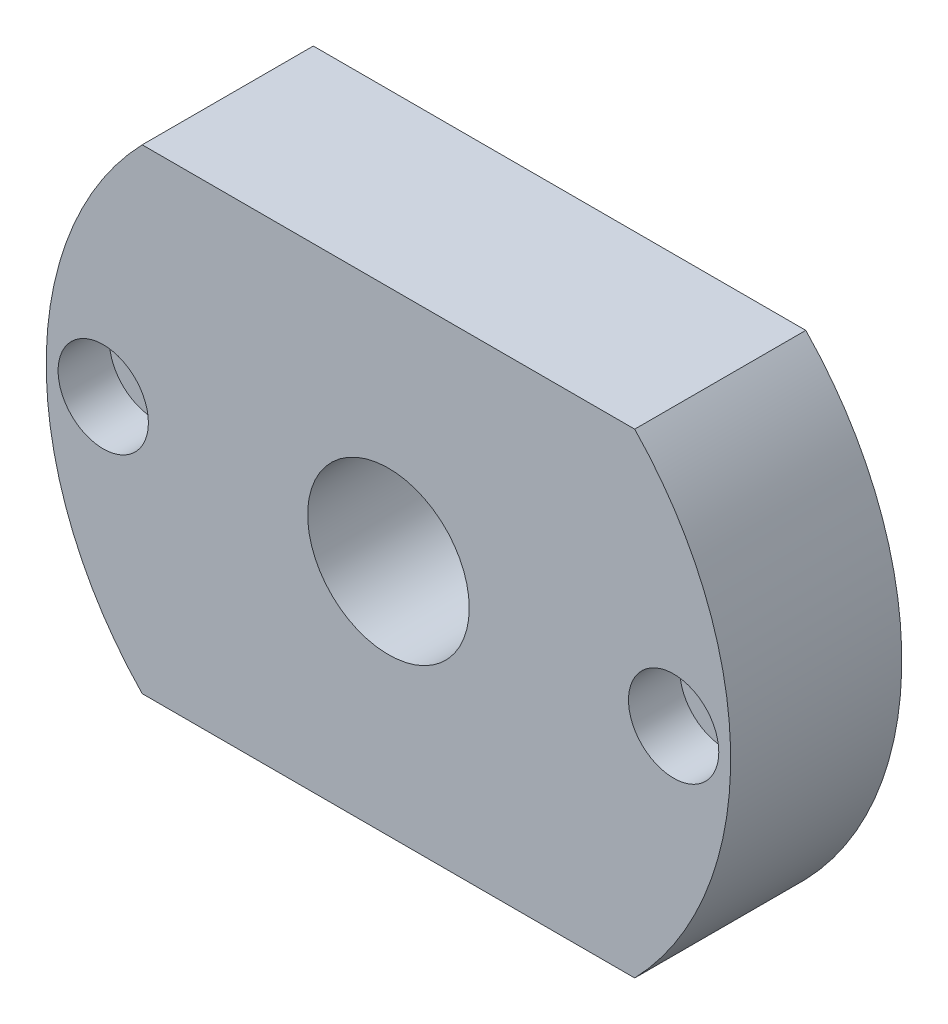
ISO-10303-21;
HEADER;
FILE_DESCRIPTION(('STEP AP214'),'2;1');
FILE_NAME('part.step','',(''),(''),'','','');
FILE_SCHEMA(('AUTOMOTIVE_DESIGN { 1 0 10303 214 1 1 1 1 }'));
ENDSEC;
DATA;
#1=APPLICATION_CONTEXT('core data for automotive mechanical design processes');
#2=APPLICATION_PROTOCOL_DEFINITION('international standard','automotive_design',2000,#1);
#3=PRODUCT_CONTEXT('',#1,'mechanical');
#4=PRODUCT('Part','Part','',(#3));
#5=PRODUCT_RELATED_PRODUCT_CATEGORY('part','',(#4));
#6=PRODUCT_DEFINITION_FORMATION('','',#4);
#7=PRODUCT_DEFINITION_CONTEXT('part definition',#1,'design');
#8=PRODUCT_DEFINITION('design','',#6,#7);
#9=PRODUCT_DEFINITION_SHAPE('','',#8);
#10=(LENGTH_UNIT() NAMED_UNIT(*) SI_UNIT(.MILLI.,.METRE.));
#11=(NAMED_UNIT(*) PLANE_ANGLE_UNIT() SI_UNIT($,.RADIAN.));
#12=(NAMED_UNIT(*) SI_UNIT($,.STERADIAN.) SOLID_ANGLE_UNIT());
#13=UNCERTAINTY_MEASURE_WITH_UNIT(LENGTH_MEASURE(1.E-05),#10,'distance_accuracy_value','');
#14=(GEOMETRIC_REPRESENTATION_CONTEXT(3) GLOBAL_UNCERTAINTY_ASSIGNED_CONTEXT((#13)) GLOBAL_UNIT_ASSIGNED_CONTEXT((#10,
#11,#12)) REPRESENTATION_CONTEXT('',''));
#15=CARTESIAN_POINT('',(0.,0.,0.));
#16=DIRECTION('',(0.,0.,1.));
#17=DIRECTION('',(1.,0.,0.));
#18=AXIS2_PLACEMENT_3D('',#15,#16,#17);
#19=CARTESIAN_POINT('',(506.510652388512,-401.151572168843,-658.825));
#20=DIRECTION('',(0.,0.,1.));
#21=DIRECTION('',(1.,0.,0.));
#22=AXIS2_PLACEMENT_3D('',#19,#20,#21);
#23=CYLINDRICAL_SURFACE('',#22,4.75);
#24=CARTESIAN_POINT('',(506.510652388512,-401.151572168843,-658.825));
#25=DIRECTION('',(0.,0.,1.));
#26=DIRECTION('',(1.,0.,0.));
#27=AXIS2_PLACEMENT_3D('',#24,#25,#26);
#28=CIRCLE('',#27,4.75);
#29=CARTESIAN_POINT('',(511.260652388512,-401.151572168843,-658.825));
#30=VERTEX_POINT('',#29);
#31=EDGE_CURVE('E20',#30,#30,#28,.F.);
#32=ORIENTED_EDGE('',*,*,#31,.F.);
#33=EDGE_LOOP('',(#32));
#34=FACE_BOUND('',#33,.T.);
#35=CARTESIAN_POINT('',(506.510652388512,-401.151572168843,-664.225));
#36=DIRECTION('',(0.,0.,1.));
#37=DIRECTION('',(1.,0.,0.));
#38=AXIS2_PLACEMENT_3D('',#35,#36,#37);
#39=CIRCLE('',#38,4.75);
#40=CARTESIAN_POINT('',(511.260652388512,-401.151572168843,-664.225));
#41=VERTEX_POINT('',#40);
#42=EDGE_CURVE('E124',#41,#41,#39,.T.);
#43=ORIENTED_EDGE('',*,*,#42,.F.);
#44=EDGE_LOOP('',(#43));
#45=FACE_BOUND('',#44,.T.);
#46=ADVANCED_FACE('F17',(#34,#45),#23,.F.);
#47=CARTESIAN_POINT('',(446.510652388512,-401.151572168843,-658.825));
#48=DIRECTION('',(0.,0.,1.));
#49=DIRECTION('',(1.,0.,0.));
#50=AXIS2_PLACEMENT_3D('',#47,#48,#49);
#51=CYLINDRICAL_SURFACE('',#50,4.75);
#52=CARTESIAN_POINT('',(446.510652388512,-401.151572168843,-658.825));
#53=DIRECTION('',(0.,0.,1.));
#54=DIRECTION('',(1.,0.,0.));
#55=AXIS2_PLACEMENT_3D('',#52,#53,#54);
#56=CIRCLE('',#55,4.75);
#57=CARTESIAN_POINT('',(451.260652388512,-401.151572168843,-658.825));
#58=VERTEX_POINT('',#57);
#59=EDGE_CURVE('E127',#58,#58,#56,.F.);
#60=ORIENTED_EDGE('',*,*,#59,.F.);
#61=EDGE_LOOP('',(#60));
#62=FACE_BOUND('',#61,.T.);
#63=CARTESIAN_POINT('',(446.510652388512,-401.151572168843,-664.225));
#64=DIRECTION('',(0.,0.,1.));
#65=DIRECTION('',(1.,0.,0.));
#66=AXIS2_PLACEMENT_3D('',#63,#64,#65);
#67=CIRCLE('',#66,4.75);
#68=CARTESIAN_POINT('',(451.260652388512,-401.151572168843,-664.225));
#69=VERTEX_POINT('',#68);
#70=EDGE_CURVE('E79',#69,#69,#67,.T.);
#71=ORIENTED_EDGE('',*,*,#70,.F.);
#72=EDGE_LOOP('',(#71));
#73=FACE_BOUND('',#72,.T.);
#74=ADVANCED_FACE('F140',(#62,#73),#51,.F.);
#75=CARTESIAN_POINT('',(401.510652388512,-401.151572168843,-658.825));
#76=DIRECTION('',(0.,0.,1.));
#77=DIRECTION('',(1.,0.,0.));
#78=AXIS2_PLACEMENT_3D('',#75,#76,#77);
#79=PLANE('',#78);
#80=ORIENTED_EDGE('',*,*,#59,.T.);
#81=EDGE_LOOP('',(#80));
#82=FACE_BOUND('',#81,.T.);
#83=ORIENTED_EDGE('',*,*,#31,.T.);
#84=EDGE_LOOP('',(#83));
#85=FACE_BOUND('',#84,.T.);
#86=CARTESIAN_POINT('',(476.510652388512,-401.151572168843,-658.825));
#87=DIRECTION('',(0.,0.,1.));
#88=DIRECTION('',(1.,0.,0.));
#89=AXIS2_PLACEMENT_3D('',#86,#87,#88);
#90=CIRCLE('',#89,8.5);
#91=CARTESIAN_POINT('',(485.010652388512,-401.151572168843,-658.825));
#92=VERTEX_POINT('',#91);
#93=EDGE_CURVE('E114',#92,#92,#90,.F.);
#94=ORIENTED_EDGE('',*,*,#93,.T.);
#95=EDGE_LOOP('',(#94));
#96=FACE_BOUND('',#95,.T.);
#97=DIRECTION('',(1.,0.,0.));
#98=VECTOR('',#97,1.);
#99=CARTESIAN_POINT('',(502.414320082489,-426.151572168843,-658.825));
#100=LINE('',#99,#98);
#101=CARTESIAN_POINT('',(502.414320082489,-426.151572168843,-658.825));
#102=VERTEX_POINT('',#101);
#103=CARTESIAN_POINT('',(450.606984694534,-426.151572168843,-658.825));
#104=VERTEX_POINT('',#103);
#105=EDGE_CURVE('E55',#102,#104,#100,.F.);
#106=ORIENTED_EDGE('',*,*,#105,.F.);
#107=CARTESIAN_POINT('',(476.510652388512,-401.151572168843,-658.825));
#108=DIRECTION('',(0.,0.,1.));
#109=DIRECTION('',(1.,0.,0.));
#110=AXIS2_PLACEMENT_3D('',#107,#108,#109);
#111=CIRCLE('',#110,36.);
#112=CARTESIAN_POINT('',(502.414320082489,-376.151572168843,-658.825));
#113=VERTEX_POINT('',#112);
#114=EDGE_CURVE('E74',#113,#102,#111,.F.);
#115=ORIENTED_EDGE('',*,*,#114,.F.);
#116=DIRECTION('',(-1.,0.,0.));
#117=VECTOR('',#116,1.);
#118=CARTESIAN_POINT('',(450.606984694534,-376.151572168843,-658.825));
#119=LINE('',#118,#117);
#120=CARTESIAN_POINT('',(450.606984694535,-376.151572168843,-658.825));
#121=VERTEX_POINT('',#120);
#122=EDGE_CURVE('E70',#121,#113,#119,.F.);
#123=ORIENTED_EDGE('',*,*,#122,.F.);
#124=CARTESIAN_POINT('',(476.510652388512,-401.151572168843,-658.825));
#125=DIRECTION('',(0.,0.,1.));
#126=DIRECTION('',(1.,0.,0.));
#127=AXIS2_PLACEMENT_3D('',#124,#125,#126);
#128=CIRCLE('',#127,36.);
#129=EDGE_CURVE('E60',#104,#121,#128,.F.);
#130=ORIENTED_EDGE('',*,*,#129,.F.);
#131=EDGE_LOOP('',(#106,#115,#123,#130));
#132=FACE_BOUND('',#131,.T.);
#133=ADVANCED_FACE('F73',(#82,#85,#96,#132),#79,.T.);
#134=CARTESIAN_POINT('',(401.510652388512,-401.151572168843,-664.225));
#135=DIRECTION('',(0.,0.,1.));
#136=DIRECTION('',(1.,0.,0.));
#137=AXIS2_PLACEMENT_3D('',#134,#135,#136);
#138=PLANE('',#137);
#139=CARTESIAN_POINT('',(506.510652388512,-401.151572168843,-664.225));
#140=DIRECTION('',(0.,0.,1.));
#141=DIRECTION('',(1.,0.,0.));
#142=AXIS2_PLACEMENT_3D('',#139,#140,#141);
#143=CIRCLE('',#142,2.6);
#144=CARTESIAN_POINT('',(509.110652388512,-401.151572168843,-664.225));
#145=VERTEX_POINT('',#144);
#146=EDGE_CURVE('E110',#145,#145,#143,.F.);
#147=ORIENTED_EDGE('',*,*,#146,.T.);
#148=EDGE_LOOP('',(#147));
#149=FACE_BOUND('',#148,.T.);
#150=ORIENTED_EDGE('',*,*,#42,.T.);
#151=EDGE_LOOP('',(#150));
#152=FACE_BOUND('',#151,.T.);
#153=ADVANCED_FACE('F143',(#149,#152),#138,.T.);
#154=CARTESIAN_POINT('',(401.510652388512,-401.151572168843,-664.225));
#155=DIRECTION('',(0.,0.,1.));
#156=DIRECTION('',(1.,0.,0.));
#157=AXIS2_PLACEMENT_3D('',#154,#155,#156);
#158=PLANE('',#157);
#159=CARTESIAN_POINT('',(446.510652388512,-401.151572168843,-664.225));
#160=DIRECTION('',(0.,0.,1.));
#161=DIRECTION('',(1.,0.,0.));
#162=AXIS2_PLACEMENT_3D('',#159,#160,#161);
#163=CIRCLE('',#162,2.6);
#164=CARTESIAN_POINT('',(449.110652388512,-401.151572168843,-664.225));
#165=VERTEX_POINT('',#164);
#166=EDGE_CURVE('E106',#165,#165,#163,.F.);
#167=ORIENTED_EDGE('',*,*,#166,.T.);
#168=EDGE_LOOP('',(#167));
#169=FACE_BOUND('',#168,.T.);
#170=ORIENTED_EDGE('',*,*,#70,.T.);
#171=EDGE_LOOP('',(#170));
#172=FACE_BOUND('',#171,.T.);
#173=ADVANCED_FACE('F145',(#169,#172),#158,.T.);
#174=CARTESIAN_POINT('',(450.606984694534,-376.151572168843,-676.825));
#175=DIRECTION('',(0.,1.,0.));
#176=DIRECTION('',(-1.,0.,0.));
#177=AXIS2_PLACEMENT_3D('',#174,#175,#176);
#178=PLANE('',#177);
#179=ORIENTED_EDGE('',*,*,#122,.T.);
#180=DIRECTION('',(0.,0.,1.));
#181=VECTOR('',#180,1.);
#182=CARTESIAN_POINT('',(502.414320082489,-376.151572168843,-676.825));
#183=LINE('',#182,#181);
#184=CARTESIAN_POINT('',(502.414320082489,-376.151572168843,-676.825));
#185=VERTEX_POINT('',#184);
#186=EDGE_CURVE('E119',#185,#113,#183,.T.);
#187=ORIENTED_EDGE('',*,*,#186,.F.);
#188=DIRECTION('',(1.,0.,0.));
#189=VECTOR('',#188,1.);
#190=CARTESIAN_POINT('',(401.510652388512,-376.151572168843,-676.825));
#191=LINE('',#190,#189);
#192=CARTESIAN_POINT('',(450.606984694535,-376.151572168843,-676.825));
#193=VERTEX_POINT('',#192);
#194=EDGE_CURVE('E83',#185,#193,#191,.F.);
#195=ORIENTED_EDGE('',*,*,#194,.T.);
#196=DIRECTION('',(0.,0.,1.));
#197=VECTOR('',#196,1.);
#198=CARTESIAN_POINT('',(450.606984694534,-376.151572168843,-676.825));
#199=LINE('',#198,#197);
#200=EDGE_CURVE('E65',#121,#193,#199,.F.);
#201=ORIENTED_EDGE('',*,*,#200,.F.);
#202=EDGE_LOOP('',(#179,#187,#195,#201));
#203=FACE_BOUND('',#202,.T.);
#204=ADVANCED_FACE('F82',(#203),#178,.T.);
#205=CARTESIAN_POINT('',(476.510652388512,-401.151572168843,-676.825));
#206=DIRECTION('',(0.,0.,1.));
#207=DIRECTION('',(1.,0.,0.));
#208=AXIS2_PLACEMENT_3D('',#205,#206,#207);
#209=CYLINDRICAL_SURFACE('',#208,36.);
#210=ORIENTED_EDGE('',*,*,#129,.T.);
#211=ORIENTED_EDGE('',*,*,#200,.T.);
#212=CARTESIAN_POINT('',(476.510652388512,-401.151572168843,-676.825));
#213=DIRECTION('',(0.,0.,1.));
#214=DIRECTION('',(1.,0.,0.));
#215=AXIS2_PLACEMENT_3D('',#212,#213,#214);
#216=CIRCLE('',#215,36.);
#217=CARTESIAN_POINT('',(450.606984694534,-426.151572168843,-676.825));
#218=VERTEX_POINT('',#217);
#219=EDGE_CURVE('E103',#193,#218,#216,.T.);
#220=ORIENTED_EDGE('',*,*,#219,.T.);
#221=DIRECTION('',(0.,0.,-1.));
#222=VECTOR('',#221,1.);
#223=CARTESIAN_POINT('',(450.606984694534,-426.151572168843,-676.825));
#224=LINE('',#223,#222);
#225=EDGE_CURVE('E67',#104,#218,#224,.T.);
#226=ORIENTED_EDGE('',*,*,#225,.F.);
#227=EDGE_LOOP('',(#210,#211,#220,#226));
#228=FACE_BOUND('',#227,.T.);
#229=ADVANCED_FACE('F62',(#228),#209,.T.);
#230=CARTESIAN_POINT('',(502.414320082489,-426.151572168843,-676.825));
#231=DIRECTION('',(0.,-1.,0.));
#232=DIRECTION('',(0.,0.,-1.));
#233=AXIS2_PLACEMENT_3D('',#230,#231,#232);
#234=PLANE('',#233);
#235=ORIENTED_EDGE('',*,*,#105,.T.);
#236=ORIENTED_EDGE('',*,*,#225,.T.);
#237=DIRECTION('',(1.,0.,0.));
#238=VECTOR('',#237,1.);
#239=CARTESIAN_POINT('',(401.510652388512,-426.151572168843,-676.825));
#240=LINE('',#239,#238);
#241=CARTESIAN_POINT('',(502.414320082489,-426.151572168843,-676.825));
#242=VERTEX_POINT('',#241);
#243=EDGE_CURVE('E102',#218,#242,#240,.T.);
#244=ORIENTED_EDGE('',*,*,#243,.T.);
#245=DIRECTION('',(0.,0.,1.));
#246=VECTOR('',#245,1.);
#247=CARTESIAN_POINT('',(502.414320082489,-426.151572168843,-676.825));
#248=LINE('',#247,#246);
#249=EDGE_CURVE('E36',#102,#242,#248,.F.);
#250=ORIENTED_EDGE('',*,*,#249,.F.);
#251=EDGE_LOOP('',(#235,#236,#244,#250));
#252=FACE_BOUND('',#251,.T.);
#253=ADVANCED_FACE('F178',(#252),#234,.T.);
#254=CARTESIAN_POINT('',(476.510652388512,-401.151572168843,-676.825));
#255=DIRECTION('',(0.,0.,1.));
#256=DIRECTION('',(1.,0.,0.));
#257=AXIS2_PLACEMENT_3D('',#254,#255,#256);
#258=CYLINDRICAL_SURFACE('',#257,36.);
#259=ORIENTED_EDGE('',*,*,#114,.T.);
#260=ORIENTED_EDGE('',*,*,#249,.T.);
#261=CARTESIAN_POINT('',(476.510652388512,-401.151572168843,-676.825));
#262=DIRECTION('',(0.,0.,1.));
#263=DIRECTION('',(1.,0.,0.));
#264=AXIS2_PLACEMENT_3D('',#261,#262,#263);
#265=CIRCLE('',#264,36.);
#266=EDGE_CURVE('E99',#242,#185,#265,.T.);
#267=ORIENTED_EDGE('',*,*,#266,.T.);
#268=ORIENTED_EDGE('',*,*,#186,.T.);
#269=EDGE_LOOP('',(#259,#260,#267,#268));
#270=FACE_BOUND('',#269,.T.);
#271=ADVANCED_FACE('F174',(#270),#258,.T.);
#272=CARTESIAN_POINT('',(476.510652388512,-401.151572168843,-676.825));
#273=DIRECTION('',(0.,0.,1.));
#274=DIRECTION('',(1.,0.,0.));
#275=AXIS2_PLACEMENT_3D('',#272,#273,#274);
#276=CYLINDRICAL_SURFACE('',#275,8.5);
#277=CARTESIAN_POINT('',(476.510652388512,-401.151572168843,-676.825));
#278=DIRECTION('',(0.,0.,1.));
#279=DIRECTION('',(1.,0.,0.));
#280=AXIS2_PLACEMENT_3D('',#277,#278,#279);
#281=CIRCLE('',#280,8.5);
#282=CARTESIAN_POINT('',(485.010652388512,-401.151572168843,-676.825));
#283=VERTEX_POINT('',#282);
#284=EDGE_CURVE('E96',#283,#283,#281,.F.);
#285=ORIENTED_EDGE('',*,*,#284,.T.);
#286=EDGE_LOOP('',(#285));
#287=FACE_BOUND('',#286,.T.);
#288=ORIENTED_EDGE('',*,*,#93,.F.);
#289=EDGE_LOOP('',(#288));
#290=FACE_BOUND('',#289,.T.);
#291=ADVANCED_FACE('F170',(#287,#290),#276,.F.);
#292=CARTESIAN_POINT('',(506.510652388512,-401.151572168843,-676.825));
#293=DIRECTION('',(0.,0.,1.));
#294=DIRECTION('',(1.,0.,0.));
#295=AXIS2_PLACEMENT_3D('',#292,#293,#294);
#296=CYLINDRICAL_SURFACE('',#295,2.6);
#297=CARTESIAN_POINT('',(506.510652388512,-401.151572168843,-676.825));
#298=DIRECTION('',(0.,0.,1.));
#299=DIRECTION('',(1.,0.,0.));
#300=AXIS2_PLACEMENT_3D('',#297,#298,#299);
#301=CIRCLE('',#300,2.6);
#302=CARTESIAN_POINT('',(509.110652388512,-401.151572168843,-676.825));
#303=VERTEX_POINT('',#302);
#304=EDGE_CURVE('E27',#303,#303,#301,.F.);
#305=ORIENTED_EDGE('',*,*,#304,.T.);
#306=EDGE_LOOP('',(#305));
#307=FACE_BOUND('',#306,.T.);
#308=ORIENTED_EDGE('',*,*,#146,.F.);
#309=EDGE_LOOP('',(#308));
#310=FACE_BOUND('',#309,.T.);
#311=ADVANCED_FACE('F162',(#307,#310),#296,.F.);
#312=CARTESIAN_POINT('',(446.510652388512,-401.151572168843,-676.825));
#313=DIRECTION('',(0.,0.,1.));
#314=DIRECTION('',(1.,0.,0.));
#315=AXIS2_PLACEMENT_3D('',#312,#313,#314);
#316=CYLINDRICAL_SURFACE('',#315,2.6);
#317=CARTESIAN_POINT('',(446.510652388512,-401.151572168843,-676.825));
#318=DIRECTION('',(0.,0.,1.));
#319=DIRECTION('',(1.,0.,0.));
#320=AXIS2_PLACEMENT_3D('',#317,#318,#319);
#321=CIRCLE('',#320,2.6);
#322=CARTESIAN_POINT('',(449.110652388512,-401.151572168843,-676.825));
#323=VERTEX_POINT('',#322);
#324=EDGE_CURVE('E11',#323,#323,#321,.F.);
#325=ORIENTED_EDGE('',*,*,#324,.T.);
#326=EDGE_LOOP('',(#325));
#327=FACE_BOUND('',#326,.T.);
#328=ORIENTED_EDGE('',*,*,#166,.F.);
#329=EDGE_LOOP('',(#328));
#330=FACE_BOUND('',#329,.T.);
#331=ADVANCED_FACE('F157',(#327,#330),#316,.F.);
#332=CARTESIAN_POINT('',(401.510652388512,-401.151572168843,-676.825));
#333=DIRECTION('',(0.,0.,1.));
#334=DIRECTION('',(1.,0.,0.));
#335=AXIS2_PLACEMENT_3D('',#332,#333,#334);
#336=PLANE('',#335);
#337=ORIENTED_EDGE('',*,*,#324,.F.);
#338=EDGE_LOOP('',(#337));
#339=FACE_BOUND('',#338,.T.);
#340=ORIENTED_EDGE('',*,*,#304,.F.);
#341=EDGE_LOOP('',(#340));
#342=FACE_BOUND('',#341,.T.);
#343=ORIENTED_EDGE('',*,*,#284,.F.);
#344=EDGE_LOOP('',(#343));
#345=FACE_BOUND('',#344,.T.);
#346=ORIENTED_EDGE('',*,*,#243,.F.);
#347=ORIENTED_EDGE('',*,*,#219,.F.);
#348=ORIENTED_EDGE('',*,*,#194,.F.);
#349=ORIENTED_EDGE('',*,*,#266,.F.);
#350=EDGE_LOOP('',(#346,#347,#348,#349));
#351=FACE_BOUND('',#350,.T.);
#352=ADVANCED_FACE('F155',(#339,#342,#345,#351),#336,.F.);
#353=CLOSED_SHELL('',(#46,#74,#133,#153,#173,#204,#229,#253,#271,#291,#311,#331,#352));
#354=MANIFOLD_SOLID_BREP('B1',#353);
#355=ADVANCED_BREP_SHAPE_REPRESENTATION('',(#18,#354),#14);
#356=SHAPE_DEFINITION_REPRESENTATION(#9,#355);
ENDSEC;
END-ISO-10303-21;
